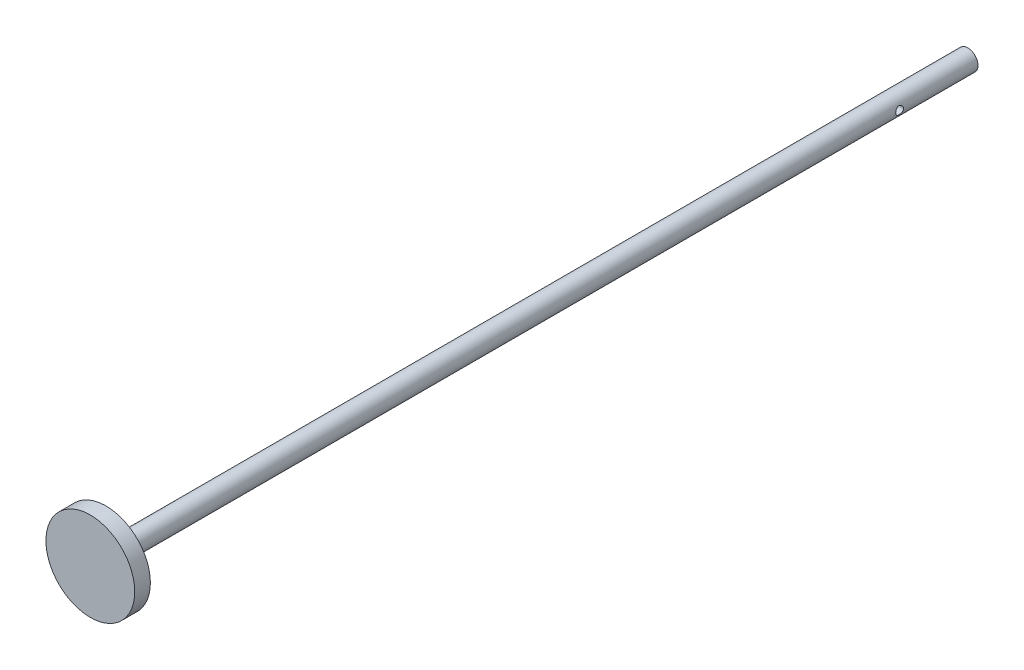
ISO-10303-21;
HEADER;
FILE_DESCRIPTION(('STEP AP214'),'2;1');
FILE_NAME('part.step','',(''),(''),'','','');
FILE_SCHEMA(('AUTOMOTIVE_DESIGN { 1 0 10303 214 1 1 1 1 }'));
ENDSEC;
DATA;
#1=APPLICATION_CONTEXT('core data for automotive mechanical design processes');
#2=APPLICATION_PROTOCOL_DEFINITION('international standard','automotive_design',2000,#1);
#3=PRODUCT_CONTEXT('',#1,'mechanical');
#4=PRODUCT('Part','Part','',(#3));
#5=PRODUCT_RELATED_PRODUCT_CATEGORY('part','',(#4));
#6=PRODUCT_DEFINITION_FORMATION('','',#4);
#7=PRODUCT_DEFINITION_CONTEXT('part definition',#1,'design');
#8=PRODUCT_DEFINITION('design','',#6,#7);
#9=PRODUCT_DEFINITION_SHAPE('','',#8);
#10=(LENGTH_UNIT() NAMED_UNIT(*) SI_UNIT(.MILLI.,.METRE.));
#11=(NAMED_UNIT(*) PLANE_ANGLE_UNIT() SI_UNIT($,.RADIAN.));
#12=(NAMED_UNIT(*) SI_UNIT($,.STERADIAN.) SOLID_ANGLE_UNIT());
#13=UNCERTAINTY_MEASURE_WITH_UNIT(LENGTH_MEASURE(1.E-05),#10,'distance_accuracy_value','');
#14=(GEOMETRIC_REPRESENTATION_CONTEXT(3) GLOBAL_UNCERTAINTY_ASSIGNED_CONTEXT((#13)) GLOBAL_UNIT_ASSIGNED_CONTEXT((#10,
#11,#12)) REPRESENTATION_CONTEXT('',''));
#15=CARTESIAN_POINT('',(0.,0.,0.));
#16=DIRECTION('',(0.,0.,1.));
#17=DIRECTION('',(1.,0.,0.));
#18=AXIS2_PLACEMENT_3D('',#15,#16,#17);
#19=CARTESIAN_POINT('',(0.,0.,165.));
#20=DIRECTION('',(0.,0.,-1.));
#21=DIRECTION('',(-1.,0.,0.));
#22=AXIS2_PLACEMENT_3D('',#19,#20,#21);
#23=CYLINDRICAL_SURFACE('',#22,1.95);
#24=CARTESIAN_POINT('',(1.95,0.,15.75));
#25=CARTESIAN_POINT('',(1.9500013889589,0.0405429191923415,15.7500018217903));
#26=CARTESIAN_POINT('',(1.94872476548912,0.081073705107054,15.7467023969003));
#27=CARTESIAN_POINT('',(1.94376018150421,0.160919968102907,15.7336485960923));
#28=CARTESIAN_POINT('',(1.94007270365798,0.2002356867988,15.7238955122345));
#29=CARTESIAN_POINT('',(1.93068098797991,0.276488400967561,15.6983330720527));
#30=CARTESIAN_POINT('',(1.9249807652981,0.313429960395833,15.6825357679138));
#31=CARTESIAN_POINT('',(1.91212797807933,0.384134726703964,15.6453962739833));
#32=CARTESIAN_POINT('',(1.90497500376771,0.41789703287691,15.6240525192399));
#33=CARTESIAN_POINT('',(1.88959736394845,0.482781776023633,15.5754391285489));
#34=CARTESIAN_POINT('',(1.88134129617782,0.513744818913311,15.5479667815009));
#35=CARTESIAN_POINT('',(1.86483836479127,0.570754120237588,15.4883063733576));
#36=CARTESIAN_POINT('',(1.85659150509628,0.596798758000072,15.456116764053));
#37=CARTESIAN_POINT('',(1.84067024000969,0.644272025035923,15.3863475062434));
#38=CARTESIAN_POINT('',(1.83303254536538,0.665470989304325,15.348602361422));
#39=CARTESIAN_POINT('',(1.81968575562311,0.701148567532011,15.2697430020534));
#40=CARTESIAN_POINT('',(1.81397584486139,0.715630024704997,15.2286302215577));
#41=CARTESIAN_POINT('',(1.80546819243754,0.736824788706112,15.1460409791322));
#42=CARTESIAN_POINT('',(1.80255650754391,0.743843403602977,15.1046550140077));
#43=CARTESIAN_POINT('',(1.79964268449158,0.750867598425582,15.0211981620069));
#44=CARTESIAN_POINT('',(1.79963926312822,0.75087627132755,14.979127585394));
#45=CARTESIAN_POINT('',(1.80244451272089,0.744112968938832,14.8983407225545));
#46=CARTESIAN_POINT('',(1.80507468879926,0.737771387119338,14.8595810361256));
#47=CARTESIAN_POINT('',(1.81255302114849,0.719201418400304,14.783725476178));
#48=CARTESIAN_POINT('',(1.81740152942031,0.706972097228781,14.7466298677384));
#49=CARTESIAN_POINT('',(1.82887311050732,0.676747991768706,14.6743025064653));
#50=CARTESIAN_POINT('',(1.83552896758488,0.658645351429962,14.6391212543349));
#51=CARTESIAN_POINT('',(1.84985510301363,0.617263834808471,14.5721736364495));
#52=CARTESIAN_POINT('',(1.85752574368349,0.593983107707849,14.5404084977631));
#53=CARTESIAN_POINT('',(1.87368103554139,0.5409615459988,14.4788222516263));
#54=CARTESIAN_POINT('',(1.88218481651937,0.510879433348211,14.449299234117));
#55=CARTESIAN_POINT('',(1.89858206047745,0.446095917136731,14.395625799215));
#56=CARTESIAN_POINT('',(1.9064754195167,0.411393729608996,14.3714762954998));
#57=CARTESIAN_POINT('',(1.92093422019693,0.337562732265244,14.3288834855355));
#58=CARTESIAN_POINT('',(1.92747477209834,0.298368629746979,14.310544302722));
#59=CARTESIAN_POINT('',(1.938305104308,0.217136899924052,14.2808201692353));
#60=CARTESIAN_POINT('',(1.94259593827185,0.175100614189489,14.2694319626608));
#61=CARTESIAN_POINT('',(1.94825556937513,0.0918827622127068,14.2545173454713));
#62=CARTESIAN_POINT('',(1.9497732661453,0.0507831531761161,14.2505898363125));
#63=CARTESIAN_POINT('',(1.95017911828569,-0.0315114168209012,14.249533968589));
#64=CARTESIAN_POINT('',(1.94906789308931,-0.0727063530351846,14.2524040083684));
#65=CARTESIAN_POINT('',(1.94443875795888,-0.152257017445377,14.264560525302));
#66=CARTESIAN_POINT('',(1.94102101913293,-0.190659983589788,14.2735800918094));
#67=CARTESIAN_POINT('',(1.93222438564929,-0.265377333725863,14.2974237691504));
#68=CARTESIAN_POINT('',(1.92684523665693,-0.301691446150019,14.3122486327713));
#69=CARTESIAN_POINT('',(1.91445348861844,-0.372419288182057,14.34776028457));
#70=CARTESIAN_POINT('',(1.90739684429773,-0.406743687293188,14.3686091443133));
#71=CARTESIAN_POINT('',(1.89242493900216,-0.471524162838173,14.4153951384382));
#72=CARTESIAN_POINT('',(1.88450935044501,-0.501978753731922,14.441334217187));
#73=CARTESIAN_POINT('',(1.86808794698959,-0.560102599037687,14.499425925205));
#74=CARTESIAN_POINT('',(1.85957560686036,-0.587488199711816,14.5318612616908));
#75=CARTESIAN_POINT('',(1.84337996356592,-0.636488942269694,14.6010286207926));
#76=CARTESIAN_POINT('',(1.83569675669773,-0.658103414313085,14.6377611414611));
#77=CARTESIAN_POINT('',(1.8220460966134,-0.695010497657832,14.7148728142191));
#78=CARTESIAN_POINT('',(1.81608939981491,-0.710263725217774,14.7552728517704));
#79=CARTESIAN_POINT('',(1.80677295827016,-0.733643588359657,14.838363181651));
#80=CARTESIAN_POINT('',(1.80341149183927,-0.741774949094471,14.881051935498));
#81=CARTESIAN_POINT('',(1.79990250805838,-0.750246631598841,14.9644165802605));
#82=CARTESIAN_POINT('',(1.79955415294045,-0.75107388882979,15.0050349057209));
#83=CARTESIAN_POINT('',(1.80159164243551,-0.746173238556253,15.0858003277304));
#84=CARTESIAN_POINT('',(1.80397719862829,-0.740446022530953,15.1259474735363));
#85=CARTESIAN_POINT('',(1.81104267682804,-0.722985410225057,15.2032488188408));
#86=CARTESIAN_POINT('',(1.81564235489165,-0.711461485190331,15.2404583106936));
#87=CARTESIAN_POINT('',(1.82656726894715,-0.682923345478796,15.3124349380378));
#88=CARTESIAN_POINT('',(1.83289295135217,-0.665907710219587,15.3472014387455));
#89=CARTESIAN_POINT('',(1.84698443494313,-0.625797958515308,15.4153605910723));
#90=CARTESIAN_POINT('',(1.85480980698614,-0.602423818284047,15.4485759724427));
#91=CARTESIAN_POINT('',(1.87082311830124,-0.550684721970978,15.5107679153727));
#92=CARTESIAN_POINT('',(1.87901117513766,-0.522318138596517,15.5397430891744));
#93=CARTESIAN_POINT('',(1.89539881550091,-0.45943149065705,15.5943526127907));
#94=CARTESIAN_POINT('',(1.90357142425467,-0.424649648805946,15.6196950176819));
#95=CARTESIAN_POINT('',(1.91851148284897,-0.351032148711191,15.6641732578928));
#96=CARTESIAN_POINT('',(1.9252786967441,-0.312195811418457,15.6833080513472));
#97=CARTESIAN_POINT('',(1.93700741831298,-0.228870252669731,15.7157113257056));
#98=CARTESIAN_POINT('',(1.94182221166289,-0.184177511259418,15.7285153128165));
#99=CARTESIAN_POINT('',(1.94831680873258,-0.0929838293532721,15.7456561814774));
#100=CARTESIAN_POINT('',(1.94999840750782,-0.0464839398001038,15.7499979112508));
#101=CARTESIAN_POINT('',(1.95,0.,15.75));
#102=B_SPLINE_CURVE_WITH_KNOTS('',3,(#24,#25,#26,#27,#28,#29,#30,#31,#32,#33,#34,#35,#36,#37,
#38,#39,#40,#41,#42,#43,#44,#45,#46,#47,#48,#49,#50,#51,#52,#53,#54,#55,#56,#57,#58,#59,#60,#61,
#62,#63,#64,#65,#66,#67,#68,#69,#70,#71,#72,#73,#74,#75,#76,#77,#78,#79,#80,#81,#82,#83,#84,#85,
#86,#87,#88,#89,#90,#91,#92,#93,#94,#95,#96,#97,#98,#99,#100,#101),.UNSPECIFIED.,.T.,.F.,(4,2,2,
2,2,2,2,2,2,2,2,2,2,2,2,2,2,2,2,2,2,2,2,2,2,2,2,2,2,2,2,2,2,2,2,2,2,2,4),(0.,0.121457218701955,
0.242890128313581,0.364082151895033,0.485308407455808,0.6113787099086,0.737490481793605,
0.8687097231382,0.999873374585369,1.12543609823519,1.250943420181,1.36848366926548,
1.48604257589701,1.60589565334463,1.72579163925049,1.85419904496568,1.98262826759135,
2.11324351920224,2.24379754238028,2.36710883693885,2.49039107946489,2.60863705924402,
2.72689837735152,2.84869698288169,2.97054220404971,3.09982797856257,3.22912875243277,
3.35921857744995,3.48922202610225,3.61048734931737,3.73173988054835,3.84889560575542,
3.96608166084622,4.08963459462097,4.21322787545638,4.34400255536973,4.47479917274035,
4.61413416828712,4.75338931209276),.UNSPECIFIED.);
#103=CARTESIAN_POINT('',(1.95,0.,15.75));
#104=VERTEX_POINT('',#103);
#105=EDGE_CURVE('E53',#104,#104,#102,.T.);
#106=ORIENTED_EDGE('',*,*,#105,.T.);
#107=EDGE_LOOP('',(#106));
#108=FACE_BOUND('',#107,.T.);
#109=CARTESIAN_POINT('',(-1.95,0.,15.75));
#110=CARTESIAN_POINT('',(-1.9500013889589,-0.0405429191923415,15.7500018217903));
#111=CARTESIAN_POINT('',(-1.94872476548912,-0.0810737051070541,15.7467023969003));
#112=CARTESIAN_POINT('',(-1.94376018150421,-0.160919968102907,15.7336485960923));
#113=CARTESIAN_POINT('',(-1.94007270365798,-0.2002356867988,15.7238955122345));
#114=CARTESIAN_POINT('',(-1.93068098797991,-0.276488400967561,15.6983330720527));
#115=CARTESIAN_POINT('',(-1.9249807652981,-0.313429960395833,15.6825357679138));
#116=CARTESIAN_POINT('',(-1.91212797807933,-0.384134726703964,15.6453962739833));
#117=CARTESIAN_POINT('',(-1.90497500376771,-0.41789703287691,15.6240525192399));
#118=CARTESIAN_POINT('',(-1.88959736394845,-0.482781776023633,15.5754391285489));
#119=CARTESIAN_POINT('',(-1.88134129617782,-0.51374481891331,15.5479667815009));
#120=CARTESIAN_POINT('',(-1.86483836479127,-0.570754120237588,15.4883063733576));
#121=CARTESIAN_POINT('',(-1.85659150509628,-0.596798758000072,15.456116764053));
#122=CARTESIAN_POINT('',(-1.84067024000969,-0.644272025035923,15.3863475062434));
#123=CARTESIAN_POINT('',(-1.83303254536538,-0.665470989304325,15.348602361422));
#124=CARTESIAN_POINT('',(-1.81968575562311,-0.701148567532011,15.2697430020534));
#125=CARTESIAN_POINT('',(-1.81397584486139,-0.715630024704997,15.2286302215577));
#126=CARTESIAN_POINT('',(-1.80546819243754,-0.736824788706112,15.1460409791322));
#127=CARTESIAN_POINT('',(-1.80255650754391,-0.743843403602977,15.1046550140077));
#128=CARTESIAN_POINT('',(-1.79964268449158,-0.750867598425582,15.0211981620069));
#129=CARTESIAN_POINT('',(-1.79963926312822,-0.75087627132755,14.979127585394));
#130=CARTESIAN_POINT('',(-1.80244451272089,-0.744112968938832,14.8983407225545));
#131=CARTESIAN_POINT('',(-1.80507468879926,-0.737771387119338,14.8595810361256));
#132=CARTESIAN_POINT('',(-1.81255302114849,-0.719201418400304,14.783725476178));
#133=CARTESIAN_POINT('',(-1.81740152942031,-0.706972097228781,14.7466298677384));
#134=CARTESIAN_POINT('',(-1.82887311050732,-0.676747991768706,14.6743025064653));
#135=CARTESIAN_POINT('',(-1.83552896758488,-0.658645351429962,14.6391212543349));
#136=CARTESIAN_POINT('',(-1.84985510301363,-0.617263834808472,14.5721736364495));
#137=CARTESIAN_POINT('',(-1.85752574368349,-0.59398310770785,14.5404084977631));
#138=CARTESIAN_POINT('',(-1.87368103554139,-0.5409615459988,14.4788222516263));
#139=CARTESIAN_POINT('',(-1.88218481651937,-0.510879433348211,14.449299234117));
#140=CARTESIAN_POINT('',(-1.89858206047745,-0.446095917136731,14.395625799215));
#141=CARTESIAN_POINT('',(-1.9064754195167,-0.411393729608997,14.3714762954998));
#142=CARTESIAN_POINT('',(-1.92093422019693,-0.337562732265245,14.3288834855355));
#143=CARTESIAN_POINT('',(-1.92747477209834,-0.29836862974698,14.310544302722));
#144=CARTESIAN_POINT('',(-1.938305104308,-0.217136899924053,14.2808201692353));
#145=CARTESIAN_POINT('',(-1.94259593827185,-0.175100614189491,14.2694319626608));
#146=CARTESIAN_POINT('',(-1.94825556937513,-0.091882762212708,14.2545173454713));
#147=CARTESIAN_POINT('',(-1.9497732661453,-0.0507831531761169,14.2505898363125));
#148=CARTESIAN_POINT('',(-1.95017911828569,0.0315114168209009,14.249533968589));
#149=CARTESIAN_POINT('',(-1.94906789308931,0.0727063530351844,14.2524040083684));
#150=CARTESIAN_POINT('',(-1.94443875795888,0.152257017445377,14.264560525302));
#151=CARTESIAN_POINT('',(-1.94102101913293,0.190659983589788,14.2735800918094));
#152=CARTESIAN_POINT('',(-1.93222438564929,0.265377333725863,14.2974237691504));
#153=CARTESIAN_POINT('',(-1.92684523665693,0.301691446150019,14.3122486327713));
#154=CARTESIAN_POINT('',(-1.91445348861844,0.372419288182056,14.34776028457));
#155=CARTESIAN_POINT('',(-1.90739684429773,0.406743687293188,14.3686091443133));
#156=CARTESIAN_POINT('',(-1.89242493900216,0.471524162838173,14.4153951384382));
#157=CARTESIAN_POINT('',(-1.88450935044501,0.501978753731922,14.441334217187));
#158=CARTESIAN_POINT('',(-1.86808794698959,0.560102599037687,14.499425925205));
#159=CARTESIAN_POINT('',(-1.85957560686036,0.587488199711816,14.5318612616908));
#160=CARTESIAN_POINT('',(-1.84337996356592,0.636488942269693,14.6010286207926));
#161=CARTESIAN_POINT('',(-1.83569675669773,0.658103414313085,14.6377611414611));
#162=CARTESIAN_POINT('',(-1.8220460966134,0.695010497657832,14.7148728142191));
#163=CARTESIAN_POINT('',(-1.81608939981491,0.710263725217773,14.7552728517704));
#164=CARTESIAN_POINT('',(-1.80677295827016,0.733643588359657,14.838363181651));
#165=CARTESIAN_POINT('',(-1.80341149183927,0.74177494909447,14.881051935498));
#166=CARTESIAN_POINT('',(-1.79990250805838,0.750246631598841,14.9644165802605));
#167=CARTESIAN_POINT('',(-1.79955415294045,0.75107388882979,15.0050349057209));
#168=CARTESIAN_POINT('',(-1.80159164243551,0.746173238556253,15.0858003277304));
#169=CARTESIAN_POINT('',(-1.8039771986283,0.740446022530953,15.1259474735363));
#170=CARTESIAN_POINT('',(-1.81104267682804,0.722985410225058,15.2032488188408));
#171=CARTESIAN_POINT('',(-1.81564235489165,0.711461485190332,15.2404583106936));
#172=CARTESIAN_POINT('',(-1.82656726894715,0.682923345478797,15.3124349380378));
#173=CARTESIAN_POINT('',(-1.83289295135217,0.665907710219588,15.3472014387455));
#174=CARTESIAN_POINT('',(-1.84698443494313,0.625797958515309,15.4153605910723));
#175=CARTESIAN_POINT('',(-1.85480980698614,0.602423818284048,15.4485759724427));
#176=CARTESIAN_POINT('',(-1.87082311830124,0.550684721970978,15.5107679153727));
#177=CARTESIAN_POINT('',(-1.87901117513766,0.522318138596517,15.5397430891744));
#178=CARTESIAN_POINT('',(-1.89539881550091,0.45943149065705,15.5943526127907));
#179=CARTESIAN_POINT('',(-1.90357142425466,0.424649648805946,15.6196950176819));
#180=CARTESIAN_POINT('',(-1.91851148284897,0.351032148711191,15.6641732578928));
#181=CARTESIAN_POINT('',(-1.9252786967441,0.312195811418457,15.6833080513472));
#182=CARTESIAN_POINT('',(-1.93700741831298,0.228870252669731,15.7157113257056));
#183=CARTESIAN_POINT('',(-1.94182221166289,0.184177511259417,15.7285153128165));
#184=CARTESIAN_POINT('',(-1.94831680873259,0.0929838293532716,15.7456561814774));
#185=CARTESIAN_POINT('',(-1.94999840750782,0.0464839398001036,15.7499979112508));
#186=CARTESIAN_POINT('',(-1.95,0.,15.75));
#187=B_SPLINE_CURVE_WITH_KNOTS('',3,(#109,#110,#111,#112,#113,#114,#115,#116,#117,#118,#119,
#120,#121,#122,#123,#124,#125,#126,#127,#128,#129,#130,#131,#132,#133,#134,#135,#136,#137,#138,
#139,#140,#141,#142,#143,#144,#145,#146,#147,#148,#149,#150,#151,#152,#153,#154,#155,#156,#157,
#158,#159,#160,#161,#162,#163,#164,#165,#166,#167,#168,#169,#170,#171,#172,#173,#174,#175,#176,
#177,#178,#179,#180,#181,#182,#183,#184,#185,#186),.UNSPECIFIED.,.T.,.F.,(4,2,2,2,2,2,2,2,2,2,2,
2,2,2,2,2,2,2,2,2,2,2,2,2,2,2,2,2,2,2,2,2,2,2,2,2,2,2,4),(0.,0.121457218701954,
0.242890128313581,0.364082151895034,0.485308407455808,0.611378709908599,0.737490481793605,
0.8687097231382,0.99987337458537,1.12543609823519,1.250943420181,1.36848366926548,
1.48604257589701,1.60589565334463,1.7257916392505,1.85419904496568,1.98262826759135,
2.11324351920224,2.24379754238028,2.36710883693885,2.49039107946489,2.60863705924402,
2.72689837735152,2.84869698288169,2.97054220404971,3.09982797856257,3.22912875243277,
3.35921857744995,3.48922202610225,3.61048734931737,3.73173988054835,3.84889560575542,
3.96608166084622,4.08963459462097,4.21322787545638,4.34400255536973,4.47479917274035,
4.61413416828712,4.75338931209276),.UNSPECIFIED.);
#188=CARTESIAN_POINT('',(-1.95,0.,15.75));
#189=VERTEX_POINT('',#188);
#190=EDGE_CURVE('E12',#189,#189,#187,.T.);
#191=ORIENTED_EDGE('',*,*,#190,.T.);
#192=EDGE_LOOP('',(#191));
#193=FACE_BOUND('',#192,.T.);
#194=CARTESIAN_POINT('',(0.,0.,165.));
#195=DIRECTION('',(0.,0.,1.));
#196=DIRECTION('',(1.,0.,0.));
#197=AXIS2_PLACEMENT_3D('',#194,#195,#196);
#198=CIRCLE('',#197,1.95);
#199=CARTESIAN_POINT('',(1.95,0.,165.));
#200=VERTEX_POINT('',#199);
#201=EDGE_CURVE('E62',#200,#200,#198,.T.);
#202=ORIENTED_EDGE('',*,*,#201,.F.);
#203=EDGE_LOOP('',(#202));
#204=FACE_BOUND('',#203,.T.);
#205=CARTESIAN_POINT('',(0.,0.,0.));
#206=DIRECTION('',(0.,0.,1.));
#207=DIRECTION('',(1.,0.,0.));
#208=AXIS2_PLACEMENT_3D('',#205,#206,#207);
#209=CIRCLE('',#208,1.95);
#210=CARTESIAN_POINT('',(1.95,0.,0.));
#211=VERTEX_POINT('',#210);
#212=EDGE_CURVE('E67',#211,#211,#209,.T.);
#213=ORIENTED_EDGE('',*,*,#212,.T.);
#214=EDGE_LOOP('',(#213));
#215=FACE_BOUND('',#214,.T.);
#216=ADVANCED_FACE('F49',(#108,#193,#204,#215),#23,.T.);
#217=CARTESIAN_POINT('',(0.,0.,0.));
#218=DIRECTION('',(0.,0.,1.));
#219=DIRECTION('',(1.,0.,0.));
#220=AXIS2_PLACEMENT_3D('',#217,#218,#219);
#221=PLANE('',#220);
#222=ORIENTED_EDGE('',*,*,#212,.F.);
#223=EDGE_LOOP('',(#222));
#224=FACE_BOUND('',#223,.T.);
#225=ADVANCED_FACE('F89',(#224),#221,.F.);
#226=CARTESIAN_POINT('',(0.,0.,168.));
#227=DIRECTION('',(0.,0.,-1.));
#228=DIRECTION('',(-1.,0.,0.));
#229=AXIS2_PLACEMENT_3D('',#226,#227,#228);
#230=CYLINDRICAL_SURFACE('',#229,8.5);
#231=CARTESIAN_POINT('',(0.,0.,168.));
#232=DIRECTION('',(0.,0.,1.));
#233=DIRECTION('',(1.,0.,0.));
#234=AXIS2_PLACEMENT_3D('',#231,#232,#233);
#235=CIRCLE('',#234,8.5);
#236=CARTESIAN_POINT('',(8.5,0.,168.));
#237=VERTEX_POINT('',#236);
#238=EDGE_CURVE('E101',#237,#237,#235,.T.);
#239=ORIENTED_EDGE('',*,*,#238,.F.);
#240=EDGE_LOOP('',(#239));
#241=FACE_BOUND('',#240,.T.);
#242=CARTESIAN_POINT('',(0.,0.,165.));
#243=DIRECTION('',(0.,0.,1.));
#244=DIRECTION('',(1.,0.,0.));
#245=AXIS2_PLACEMENT_3D('',#242,#243,#244);
#246=CIRCLE('',#245,8.5);
#247=CARTESIAN_POINT('',(8.5,0.,165.));
#248=VERTEX_POINT('',#247);
#249=EDGE_CURVE('E104',#248,#248,#246,.T.);
#250=ORIENTED_EDGE('',*,*,#249,.T.);
#251=EDGE_LOOP('',(#250));
#252=FACE_BOUND('',#251,.T.);
#253=ADVANCED_FACE('F83',(#241,#252),#230,.T.);
#254=CARTESIAN_POINT('',(0.,0.,168.));
#255=DIRECTION('',(0.,0.,1.));
#256=DIRECTION('',(1.,0.,0.));
#257=AXIS2_PLACEMENT_3D('',#254,#255,#256);
#258=PLANE('',#257);
#259=ORIENTED_EDGE('',*,*,#238,.T.);
#260=EDGE_LOOP('',(#259));
#261=FACE_BOUND('',#260,.T.);
#262=ADVANCED_FACE('F79',(#261),#258,.T.);
#263=CARTESIAN_POINT('',(0.,0.,165.));
#264=DIRECTION('',(0.,0.,1.));
#265=DIRECTION('',(1.,0.,0.));
#266=AXIS2_PLACEMENT_3D('',#263,#264,#265);
#267=PLANE('',#266);
#268=ORIENTED_EDGE('',*,*,#201,.T.);
#269=EDGE_LOOP('',(#268));
#270=FACE_BOUND('',#269,.T.);
#271=ORIENTED_EDGE('',*,*,#249,.F.);
#272=EDGE_LOOP('',(#271));
#273=FACE_BOUND('',#272,.T.);
#274=ADVANCED_FACE('F77',(#270,#273),#267,.F.);
#275=CARTESIAN_POINT('',(9.05,0.,15.));
#276=DIRECTION('',(-1.,0.,0.));
#277=DIRECTION('',(0.,0.,1.));
#278=AXIS2_PLACEMENT_3D('',#275,#276,#277);
#279=CYLINDRICAL_SURFACE('',#278,0.750000000000002);
#280=ORIENTED_EDGE('',*,*,#105,.F.);
#281=EDGE_LOOP('',(#280));
#282=FACE_BOUND('',#281,.T.);
#283=ORIENTED_EDGE('',*,*,#190,.F.);
#284=EDGE_LOOP('',(#283));
#285=FACE_BOUND('',#284,.T.);
#286=ADVANCED_FACE('F73',(#282,#285),#279,.F.);
#287=CLOSED_SHELL('',(#216,#225,#253,#262,#274,#286));
#288=MANIFOLD_SOLID_BREP('B2',#287);
#289=ADVANCED_BREP_SHAPE_REPRESENTATION('',(#18,#288),#14);
#290=SHAPE_DEFINITION_REPRESENTATION(#9,#289);
ENDSEC;
END-ISO-10303-21;
